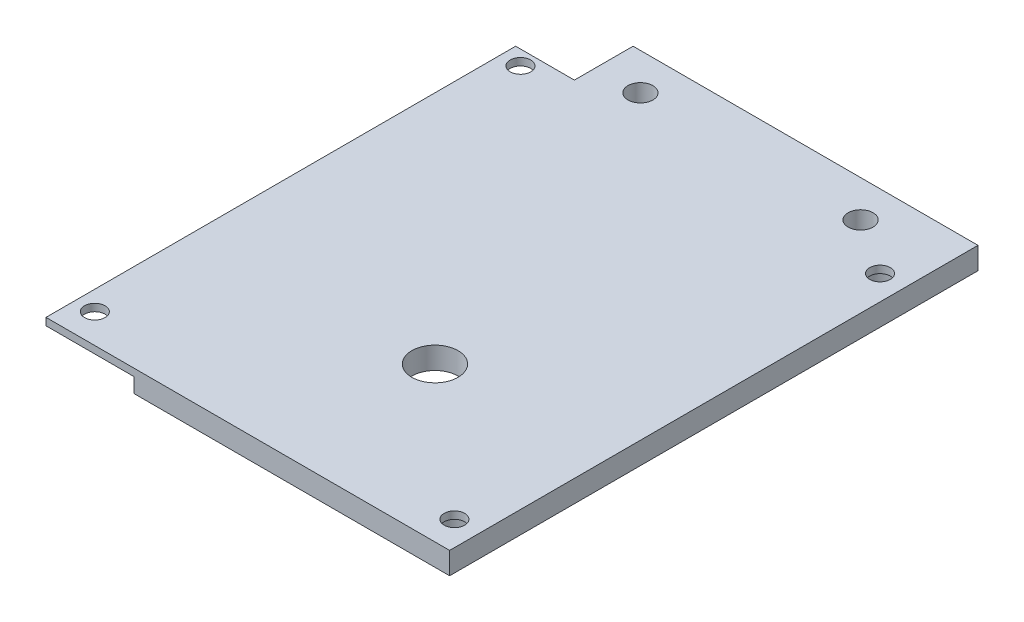
ISO-10303-21;
HEADER;
FILE_DESCRIPTION(('STEP AP214'),'2;1');
FILE_NAME('part.step','',(''),(''),'','','');
FILE_SCHEMA(('AUTOMOTIVE_DESIGN { 1 0 10303 214 1 1 1 1 }'));
ENDSEC;
DATA;
#1=APPLICATION_CONTEXT('core data for automotive mechanical design processes');
#2=APPLICATION_PROTOCOL_DEFINITION('international standard','automotive_design',2000,#1);
#3=PRODUCT_CONTEXT('',#1,'mechanical');
#4=PRODUCT('Part','Part','',(#3));
#5=PRODUCT_RELATED_PRODUCT_CATEGORY('part','',(#4));
#6=PRODUCT_DEFINITION_FORMATION('','',#4);
#7=PRODUCT_DEFINITION_CONTEXT('part definition',#1,'design');
#8=PRODUCT_DEFINITION('design','',#6,#7);
#9=PRODUCT_DEFINITION_SHAPE('','',#8);
#10=(LENGTH_UNIT() NAMED_UNIT(*) SI_UNIT(.MILLI.,.METRE.));
#11=(NAMED_UNIT(*) PLANE_ANGLE_UNIT() SI_UNIT($,.RADIAN.));
#12=(NAMED_UNIT(*) SI_UNIT($,.STERADIAN.) SOLID_ANGLE_UNIT());
#13=UNCERTAINTY_MEASURE_WITH_UNIT(LENGTH_MEASURE(1.E-05),#10,'distance_accuracy_value','');
#14=(GEOMETRIC_REPRESENTATION_CONTEXT(3) GLOBAL_UNCERTAINTY_ASSIGNED_CONTEXT((#13)) GLOBAL_UNIT_ASSIGNED_CONTEXT((#10,
#11,#12)) REPRESENTATION_CONTEXT('',''));
#15=CARTESIAN_POINT('',(0.,0.,0.));
#16=DIRECTION('',(0.,0.,1.));
#17=DIRECTION('',(1.,0.,0.));
#18=AXIS2_PLACEMENT_3D('',#15,#16,#17);
#19=CARTESIAN_POINT('',(0.,3.,36.));
#20=DIRECTION('',(0.,0.,-1.));
#21=DIRECTION('',(-1.,0.,0.));
#22=AXIS2_PLACEMENT_3D('',#19,#20,#21);
#23=PLANE('',#22);
#24=DIRECTION('',(0.,-1.,0.));
#25=VECTOR('',#24,1.);
#26=CARTESIAN_POINT('',(-17.,2.,36.));
#27=LINE('',#26,#25);
#28=CARTESIAN_POINT('',(-17.,2.,36.));
#29=VERTEX_POINT('',#28);
#30=CARTESIAN_POINT('',(-17.,0.,36.));
#31=VERTEX_POINT('',#30);
#32=EDGE_CURVE('E198',#29,#31,#27,.T.);
#33=ORIENTED_EDGE('',*,*,#32,.T.);
#34=DIRECTION('',(1.,0.,0.));
#35=VECTOR('',#34,1.);
#36=CARTESIAN_POINT('',(0.,0.,36.));
#37=LINE('',#36,#35);
#38=CARTESIAN_POINT('',(26.,0.,36.));
#39=VERTEX_POINT('',#38);
#40=EDGE_CURVE('E140',#31,#39,#37,.T.);
#41=ORIENTED_EDGE('',*,*,#40,.T.);
#42=DIRECTION('',(0.,-1.,0.));
#43=VECTOR('',#42,1.);
#44=CARTESIAN_POINT('',(26.,3.,36.));
#45=LINE('',#44,#43);
#46=CARTESIAN_POINT('',(26.,3.,36.));
#47=VERTEX_POINT('',#46);
#48=EDGE_CURVE('E104',#47,#39,#45,.T.);
#49=ORIENTED_EDGE('',*,*,#48,.F.);
#50=DIRECTION('',(1.,0.,0.));
#51=VECTOR('',#50,1.);
#52=CARTESIAN_POINT('',(0.,3.,36.));
#53=LINE('',#52,#51);
#54=CARTESIAN_POINT('',(-29.,3.,36.));
#55=VERTEX_POINT('',#54);
#56=EDGE_CURVE('E111',#55,#47,#53,.T.);
#57=ORIENTED_EDGE('',*,*,#56,.F.);
#58=DIRECTION('',(0.,-1.,0.));
#59=VECTOR('',#58,1.);
#60=CARTESIAN_POINT('',(-29.,3.,36.));
#61=LINE('',#60,#59);
#62=CARTESIAN_POINT('',(-29.,2.,36.));
#63=VERTEX_POINT('',#62);
#64=EDGE_CURVE('E43',#55,#63,#61,.T.);
#65=ORIENTED_EDGE('',*,*,#64,.T.);
#66=DIRECTION('',(1.,0.,0.));
#67=VECTOR('',#66,1.);
#68=CARTESIAN_POINT('',(0.,2.,36.));
#69=LINE('',#68,#67);
#70=EDGE_CURVE('E166',#63,#29,#69,.T.);
#71=ORIENTED_EDGE('',*,*,#70,.T.);
#72=EDGE_LOOP('',(#33,#41,#49,#57,#65,#71));
#73=FACE_BOUND('',#72,.T.);
#74=ADVANCED_FACE('F35',(#73),#23,.F.);
#75=CARTESIAN_POINT('',(0.,3.,-36.));
#76=DIRECTION('',(0.,0.,-1.));
#77=DIRECTION('',(-1.,0.,0.));
#78=AXIS2_PLACEMENT_3D('',#75,#76,#77);
#79=PLANE('',#78);
#80=DIRECTION('',(1.,0.,0.));
#81=VECTOR('',#80,1.);
#82=CARTESIAN_POINT('',(0.,0.,-36.));
#83=LINE('',#82,#81);
#84=CARTESIAN_POINT('',(-17.,0.,-36.));
#85=VERTEX_POINT('',#84);
#86=CARTESIAN_POINT('',(26.,0.,-36.));
#87=VERTEX_POINT('',#86);
#88=EDGE_CURVE('E75',#85,#87,#83,.T.);
#89=ORIENTED_EDGE('',*,*,#88,.F.);
#90=DIRECTION('',(0.,-1.,0.));
#91=VECTOR('',#90,1.);
#92=CARTESIAN_POINT('',(-17.,2.,-36.));
#93=LINE('',#92,#91);
#94=CARTESIAN_POINT('',(-17.,2.,-36.));
#95=VERTEX_POINT('',#94);
#96=EDGE_CURVE('E50',#95,#85,#93,.T.);
#97=ORIENTED_EDGE('',*,*,#96,.F.);
#98=DIRECTION('',(1.,0.,0.));
#99=VECTOR('',#98,1.);
#100=CARTESIAN_POINT('',(0.,2.,-36.));
#101=LINE('',#100,#99);
#102=CARTESIAN_POINT('',(-21.,2.,-36.));
#103=VERTEX_POINT('',#102);
#104=EDGE_CURVE('E186',#103,#95,#101,.T.);
#105=ORIENTED_EDGE('',*,*,#104,.F.);
#106=DIRECTION('',(0.,-1.,0.));
#107=VECTOR('',#106,1.);
#108=CARTESIAN_POINT('',(-21.,3.,-36.));
#109=LINE('',#108,#107);
#110=CARTESIAN_POINT('',(-21.,3.,-36.));
#111=VERTEX_POINT('',#110);
#112=EDGE_CURVE('E105',#111,#103,#109,.T.);
#113=ORIENTED_EDGE('',*,*,#112,.F.);
#114=DIRECTION('',(1.,0.,0.));
#115=VECTOR('',#114,1.);
#116=CARTESIAN_POINT('',(0.,3.,-36.));
#117=LINE('',#116,#115);
#118=CARTESIAN_POINT('',(26.,3.,-36.));
#119=VERTEX_POINT('',#118);
#120=EDGE_CURVE('E109',#111,#119,#117,.T.);
#121=ORIENTED_EDGE('',*,*,#120,.T.);
#122=DIRECTION('',(0.,-1.,0.));
#123=VECTOR('',#122,1.);
#124=CARTESIAN_POINT('',(26.,3.,-36.));
#125=LINE('',#124,#123);
#126=EDGE_CURVE('E96',#119,#87,#125,.T.);
#127=ORIENTED_EDGE('',*,*,#126,.T.);
#128=EDGE_LOOP('',(#89,#97,#105,#113,#121,#127));
#129=FACE_BOUND('',#128,.T.);
#130=ADVANCED_FACE('F114',(#129),#79,.T.);
#131=CARTESIAN_POINT('',(0.,3.,-28.));
#132=DIRECTION('',(0.,0.,-1.));
#133=DIRECTION('',(-1.,0.,0.));
#134=AXIS2_PLACEMENT_3D('',#131,#132,#133);
#135=PLANE('',#134);
#136=DIRECTION('',(1.,0.,0.));
#137=VECTOR('',#136,1.);
#138=CARTESIAN_POINT('',(0.,2.,-28.));
#139=LINE('',#138,#137);
#140=CARTESIAN_POINT('',(-29.,2.,-28.));
#141=VERTEX_POINT('',#140);
#142=CARTESIAN_POINT('',(-21.,2.,-28.));
#143=VERTEX_POINT('',#142);
#144=EDGE_CURVE('E177',#141,#143,#139,.T.);
#145=ORIENTED_EDGE('',*,*,#144,.F.);
#146=DIRECTION('',(0.,-1.,0.));
#147=VECTOR('',#146,1.);
#148=CARTESIAN_POINT('',(-29.,3.,-28.));
#149=LINE('',#148,#147);
#150=CARTESIAN_POINT('',(-29.,3.,-28.));
#151=VERTEX_POINT('',#150);
#152=EDGE_CURVE('E11',#151,#141,#149,.T.);
#153=ORIENTED_EDGE('',*,*,#152,.F.);
#154=DIRECTION('',(1.,0.,0.));
#155=VECTOR('',#154,1.);
#156=CARTESIAN_POINT('',(0.,3.,-28.));
#157=LINE('',#156,#155);
#158=CARTESIAN_POINT('',(-21.,3.,-28.));
#159=VERTEX_POINT('',#158);
#160=EDGE_CURVE('E212',#151,#159,#157,.T.);
#161=ORIENTED_EDGE('',*,*,#160,.T.);
#162=DIRECTION('',(0.,-1.,0.));
#163=VECTOR('',#162,1.);
#164=CARTESIAN_POINT('',(-21.,3.,-28.));
#165=LINE('',#164,#163);
#166=EDGE_CURVE('E139',#159,#143,#165,.T.);
#167=ORIENTED_EDGE('',*,*,#166,.T.);
#168=EDGE_LOOP('',(#145,#153,#161,#167));
#169=FACE_BOUND('',#168,.T.);
#170=ADVANCED_FACE('F214',(#169),#135,.T.);
#171=CARTESIAN_POINT('',(-29.,3.,0.));
#172=DIRECTION('',(1.,0.,0.));
#173=DIRECTION('',(0.,0.,-1.));
#174=AXIS2_PLACEMENT_3D('',#171,#172,#173);
#175=PLANE('',#174);
#176=ORIENTED_EDGE('',*,*,#152,.T.);
#177=DIRECTION('',(0.,0.,1.));
#178=VECTOR('',#177,1.);
#179=CARTESIAN_POINT('',(-29.,2.,0.));
#180=LINE('',#179,#178);
#181=EDGE_CURVE('E174',#141,#63,#180,.T.);
#182=ORIENTED_EDGE('',*,*,#181,.T.);
#183=ORIENTED_EDGE('',*,*,#64,.F.);
#184=DIRECTION('',(0.,0.,1.));
#185=VECTOR('',#184,1.);
#186=CARTESIAN_POINT('',(-29.,3.,0.));
#187=LINE('',#186,#185);
#188=EDGE_CURVE('E172',#151,#55,#187,.T.);
#189=ORIENTED_EDGE('',*,*,#188,.F.);
#190=EDGE_LOOP('',(#176,#182,#183,#189));
#191=FACE_BOUND('',#190,.T.);
#192=ADVANCED_FACE('F171',(#191),#175,.F.);
#193=CARTESIAN_POINT('',(26.,3.,0.));
#194=DIRECTION('',(1.,0.,0.));
#195=DIRECTION('',(0.,0.,-1.));
#196=AXIS2_PLACEMENT_3D('',#193,#194,#195);
#197=PLANE('',#196);
#198=DIRECTION('',(0.,0.,1.));
#199=VECTOR('',#198,1.);
#200=CARTESIAN_POINT('',(26.,0.,0.));
#201=LINE('',#200,#199);
#202=EDGE_CURVE('E101',#87,#39,#201,.T.);
#203=ORIENTED_EDGE('',*,*,#202,.F.);
#204=ORIENTED_EDGE('',*,*,#126,.F.);
#205=DIRECTION('',(0.,0.,1.));
#206=VECTOR('',#205,1.);
#207=CARTESIAN_POINT('',(26.,3.,0.));
#208=LINE('',#207,#206);
#209=EDGE_CURVE('E100',#119,#47,#208,.T.);
#210=ORIENTED_EDGE('',*,*,#209,.T.);
#211=ORIENTED_EDGE('',*,*,#48,.T.);
#212=EDGE_LOOP('',(#203,#204,#210,#211));
#213=FACE_BOUND('',#212,.T.);
#214=ADVANCED_FACE('F98',(#213),#197,.T.);
#215=CARTESIAN_POINT('',(22.6521115291552,3.,-26.));
#216=DIRECTION('',(0.,-1.,0.));
#217=DIRECTION('',(0.,0.,-1.));
#218=AXIS2_PLACEMENT_3D('',#215,#216,#217);
#219=CYLINDRICAL_SURFACE('',#218,1.4);
#220=CARTESIAN_POINT('',(22.6521115291552,2.,-26.));
#221=DIRECTION('',(0.,1.,0.));
#222=DIRECTION('',(0.,0.,1.));
#223=AXIS2_PLACEMENT_3D('',#220,#221,#222);
#224=CIRCLE('',#223,1.4);
#225=CARTESIAN_POINT('',(22.6521115291552,2.,-24.6));
#226=VERTEX_POINT('',#225);
#227=EDGE_CURVE('E488',#226,#226,#224,.T.);
#228=ORIENTED_EDGE('',*,*,#227,.F.);
#229=EDGE_LOOP('',(#228));
#230=FACE_BOUND('',#229,.T.);
#231=CARTESIAN_POINT('',(22.6521115291552,3.,-26.));
#232=DIRECTION('',(0.,1.,0.));
#233=DIRECTION('',(0.,0.,1.));
#234=AXIS2_PLACEMENT_3D('',#231,#232,#233);
#235=CIRCLE('',#234,1.4);
#236=CARTESIAN_POINT('',(22.6521115291552,3.,-24.6));
#237=VERTEX_POINT('',#236);
#238=EDGE_CURVE('E133',#237,#237,#235,.T.);
#239=ORIENTED_EDGE('',*,*,#238,.T.);
#240=EDGE_LOOP('',(#239));
#241=FACE_BOUND('',#240,.T.);
#242=ADVANCED_FACE('F259',(#230,#241),#219,.F.);
#243=CARTESIAN_POINT('',(-26.3478884708448,3.,32.));
#244=DIRECTION('',(0.,-1.,0.));
#245=DIRECTION('',(0.,0.,-1.));
#246=AXIS2_PLACEMENT_3D('',#243,#244,#245);
#247=CYLINDRICAL_SURFACE('',#246,1.4);
#248=CARTESIAN_POINT('',(-26.3478884708448,2.,32.));
#249=DIRECTION('',(0.,1.,0.));
#250=DIRECTION('',(0.,0.,1.));
#251=AXIS2_PLACEMENT_3D('',#248,#249,#250);
#252=CIRCLE('',#251,1.4);
#253=CARTESIAN_POINT('',(-26.3478884708448,2.,33.4));
#254=VERTEX_POINT('',#253);
#255=EDGE_CURVE('E181',#254,#254,#252,.T.);
#256=ORIENTED_EDGE('',*,*,#255,.F.);
#257=EDGE_LOOP('',(#256));
#258=FACE_BOUND('',#257,.T.);
#259=CARTESIAN_POINT('',(-26.3478884708448,3.,32.));
#260=DIRECTION('',(0.,1.,0.));
#261=DIRECTION('',(0.,0.,1.));
#262=AXIS2_PLACEMENT_3D('',#259,#260,#261);
#263=CIRCLE('',#262,1.4);
#264=CARTESIAN_POINT('',(-26.3478884708448,3.,33.4));
#265=VERTEX_POINT('',#264);
#266=EDGE_CURVE('E130',#265,#265,#263,.T.);
#267=ORIENTED_EDGE('',*,*,#266,.T.);
#268=EDGE_LOOP('',(#267));
#269=FACE_BOUND('',#268,.T.);
#270=ADVANCED_FACE('F249',(#258,#269),#247,.F.);
#271=CARTESIAN_POINT('',(15.,3.,-31.));
#272=DIRECTION('',(0.,-1.,0.));
#273=DIRECTION('',(0.,0.,-1.));
#274=AXIS2_PLACEMENT_3D('',#271,#272,#273);
#275=CYLINDRICAL_SURFACE('',#274,1.70000000000001);
#276=CARTESIAN_POINT('',(15.,3.,-31.));
#277=DIRECTION('',(0.,1.,0.));
#278=DIRECTION('',(0.,0.,1.));
#279=AXIS2_PLACEMENT_3D('',#276,#277,#278);
#280=CIRCLE('',#279,1.70000000000001);
#281=CARTESIAN_POINT('',(15.,3.,-29.3));
#282=VERTEX_POINT('',#281);
#283=EDGE_CURVE('E127',#282,#282,#280,.T.);
#284=ORIENTED_EDGE('',*,*,#283,.T.);
#285=EDGE_LOOP('',(#284));
#286=FACE_BOUND('',#285,.T.);
#287=CARTESIAN_POINT('',(15.,0.,-31.));
#288=DIRECTION('',(0.,1.,0.));
#289=DIRECTION('',(0.,0.,1.));
#290=AXIS2_PLACEMENT_3D('',#287,#288,#289);
#291=CIRCLE('',#290,1.70000000000001);
#292=CARTESIAN_POINT('',(15.,0.,-29.3));
#293=VERTEX_POINT('',#292);
#294=EDGE_CURVE('E151',#293,#293,#291,.T.);
#295=ORIENTED_EDGE('',*,*,#294,.F.);
#296=EDGE_LOOP('',(#295));
#297=FACE_BOUND('',#296,.T.);
#298=ADVANCED_FACE('F246',(#286,#297),#275,.F.);
#299=CARTESIAN_POINT('',(-15.,3.,-31.));
#300=DIRECTION('',(0.,-1.,0.));
#301=DIRECTION('',(0.,0.,-1.));
#302=AXIS2_PLACEMENT_3D('',#299,#300,#301);
#303=CYLINDRICAL_SURFACE('',#302,1.70000000000001);
#304=CARTESIAN_POINT('',(-15.,3.,-31.));
#305=DIRECTION('',(0.,1.,0.));
#306=DIRECTION('',(0.,0.,1.));
#307=AXIS2_PLACEMENT_3D('',#304,#305,#306);
#308=CIRCLE('',#307,1.70000000000001);
#309=CARTESIAN_POINT('',(-15.,3.,-29.3));
#310=VERTEX_POINT('',#309);
#311=EDGE_CURVE('E124',#310,#310,#308,.T.);
#312=ORIENTED_EDGE('',*,*,#311,.T.);
#313=EDGE_LOOP('',(#312));
#314=FACE_BOUND('',#313,.T.);
#315=CARTESIAN_POINT('',(-15.,0.,-31.));
#316=DIRECTION('',(0.,1.,0.));
#317=DIRECTION('',(0.,0.,1.));
#318=AXIS2_PLACEMENT_3D('',#315,#316,#317);
#319=CIRCLE('',#318,1.70000000000001);
#320=CARTESIAN_POINT('',(-15.,0.,-29.3));
#321=VERTEX_POINT('',#320);
#322=EDGE_CURVE('E148',#321,#321,#319,.T.);
#323=ORIENTED_EDGE('',*,*,#322,.F.);
#324=EDGE_LOOP('',(#323));
#325=FACE_BOUND('',#324,.T.);
#326=ADVANCED_FACE('F248',(#314,#325),#303,.F.);
#327=CARTESIAN_POINT('',(3.,3.,15.));
#328=DIRECTION('',(0.,-1.,0.));
#329=DIRECTION('',(0.,0.,-1.));
#330=AXIS2_PLACEMENT_3D('',#327,#328,#329);
#331=CYLINDRICAL_SURFACE('',#330,3.15);
#332=CARTESIAN_POINT('',(3.,3.,15.));
#333=DIRECTION('',(0.,1.,0.));
#334=DIRECTION('',(0.,0.,1.));
#335=AXIS2_PLACEMENT_3D('',#332,#333,#334);
#336=CIRCLE('',#335,3.15);
#337=CARTESIAN_POINT('',(3.,3.,18.15));
#338=VERTEX_POINT('',#337);
#339=EDGE_CURVE('E118',#338,#338,#336,.T.);
#340=ORIENTED_EDGE('',*,*,#339,.T.);
#341=EDGE_LOOP('',(#340));
#342=FACE_BOUND('',#341,.T.);
#343=CARTESIAN_POINT('',(3.,0.,15.));
#344=DIRECTION('',(0.,1.,0.));
#345=DIRECTION('',(0.,0.,1.));
#346=AXIS2_PLACEMENT_3D('',#343,#344,#345);
#347=CIRCLE('',#346,3.15);
#348=CARTESIAN_POINT('',(3.,0.,18.15));
#349=VERTEX_POINT('',#348);
#350=EDGE_CURVE('E145',#349,#349,#347,.T.);
#351=ORIENTED_EDGE('',*,*,#350,.F.);
#352=EDGE_LOOP('',(#351));
#353=FACE_BOUND('',#352,.T.);
#354=ADVANCED_FACE('F256',(#342,#353),#331,.F.);
#355=CARTESIAN_POINT('',(-21.,3.,0.));
#356=DIRECTION('',(1.,0.,0.));
#357=DIRECTION('',(0.,0.,-1.));
#358=AXIS2_PLACEMENT_3D('',#355,#356,#357);
#359=PLANE('',#358);
#360=ORIENTED_EDGE('',*,*,#112,.T.);
#361=DIRECTION('',(0.,0.,1.));
#362=VECTOR('',#361,1.);
#363=CARTESIAN_POINT('',(-21.,2.,0.));
#364=LINE('',#363,#362);
#365=EDGE_CURVE('E189',#103,#143,#364,.T.);
#366=ORIENTED_EDGE('',*,*,#365,.T.);
#367=ORIENTED_EDGE('',*,*,#166,.F.);
#368=DIRECTION('',(0.,0.,1.));
#369=VECTOR('',#368,1.);
#370=CARTESIAN_POINT('',(-21.,3.,0.));
#371=LINE('',#370,#369);
#372=EDGE_CURVE('E59',#111,#159,#371,.T.);
#373=ORIENTED_EDGE('',*,*,#372,.F.);
#374=EDGE_LOOP('',(#360,#366,#367,#373));
#375=FACE_BOUND('',#374,.T.);
#376=ADVANCED_FACE('F217',(#375),#359,.F.);
#377=CARTESIAN_POINT('',(-26.3478884708448,3.,-26.));
#378=DIRECTION('',(0.,-1.,0.));
#379=DIRECTION('',(0.,0.,-1.));
#380=AXIS2_PLACEMENT_3D('',#377,#378,#379);
#381=CYLINDRICAL_SURFACE('',#380,1.4);
#382=CARTESIAN_POINT('',(-26.3478884708448,2.,-26.));
#383=DIRECTION('',(0.,1.,0.));
#384=DIRECTION('',(0.,0.,1.));
#385=AXIS2_PLACEMENT_3D('',#382,#383,#384);
#386=CIRCLE('',#385,1.4);
#387=CARTESIAN_POINT('',(-26.3478884708448,2.,-24.6));
#388=VERTEX_POINT('',#387);
#389=EDGE_CURVE('E192',#388,#388,#386,.T.);
#390=ORIENTED_EDGE('',*,*,#389,.F.);
#391=EDGE_LOOP('',(#390));
#392=FACE_BOUND('',#391,.T.);
#393=CARTESIAN_POINT('',(-26.3478884708448,3.,-26.));
#394=DIRECTION('',(0.,1.,0.));
#395=DIRECTION('',(0.,0.,1.));
#396=AXIS2_PLACEMENT_3D('',#393,#394,#395);
#397=CIRCLE('',#396,1.4);
#398=CARTESIAN_POINT('',(-26.3478884708448,3.,-24.6));
#399=VERTEX_POINT('',#398);
#400=EDGE_CURVE('E154',#399,#399,#397,.T.);
#401=ORIENTED_EDGE('',*,*,#400,.T.);
#402=EDGE_LOOP('',(#401));
#403=FACE_BOUND('',#402,.T.);
#404=ADVANCED_FACE('F37',(#392,#403),#381,.F.);
#405=CARTESIAN_POINT('',(22.6521115291552,3.,32.));
#406=DIRECTION('',(0.,-1.,0.));
#407=DIRECTION('',(0.,0.,-1.));
#408=AXIS2_PLACEMENT_3D('',#405,#406,#407);
#409=CYLINDRICAL_SURFACE('',#408,1.4);
#410=CARTESIAN_POINT('',(22.6521115291552,2.,32.));
#411=DIRECTION('',(0.,1.,0.));
#412=DIRECTION('',(0.,0.,1.));
#413=AXIS2_PLACEMENT_3D('',#410,#411,#412);
#414=CIRCLE('',#413,1.4);
#415=CARTESIAN_POINT('',(22.6521115291552,2.,33.4));
#416=VERTEX_POINT('',#415);
#417=EDGE_CURVE('E201',#416,#416,#414,.T.);
#418=ORIENTED_EDGE('',*,*,#417,.F.);
#419=EDGE_LOOP('',(#418));
#420=FACE_BOUND('',#419,.T.);
#421=CARTESIAN_POINT('',(22.6521115291552,3.,32.));
#422=DIRECTION('',(0.,1.,0.));
#423=DIRECTION('',(0.,0.,1.));
#424=AXIS2_PLACEMENT_3D('',#421,#422,#423);
#425=CIRCLE('',#424,1.4);
#426=CARTESIAN_POINT('',(22.6521115291552,3.,33.4));
#427=VERTEX_POINT('',#426);
#428=EDGE_CURVE('E136',#427,#427,#425,.T.);
#429=ORIENTED_EDGE('',*,*,#428,.T.);
#430=EDGE_LOOP('',(#429));
#431=FACE_BOUND('',#430,.T.);
#432=ADVANCED_FACE('F316',(#420,#431),#409,.F.);
#433=CARTESIAN_POINT('',(0.,3.,0.));
#434=DIRECTION('',(0.,1.,0.));
#435=DIRECTION('',(0.,0.,1.));
#436=AXIS2_PLACEMENT_3D('',#433,#434,#435);
#437=PLANE('',#436);
#438=ORIENTED_EDGE('',*,*,#400,.F.);
#439=EDGE_LOOP('',(#438));
#440=FACE_BOUND('',#439,.T.);
#441=ORIENTED_EDGE('',*,*,#160,.F.);
#442=ORIENTED_EDGE('',*,*,#188,.T.);
#443=ORIENTED_EDGE('',*,*,#56,.T.);
#444=ORIENTED_EDGE('',*,*,#209,.F.);
#445=ORIENTED_EDGE('',*,*,#120,.F.);
#446=ORIENTED_EDGE('',*,*,#372,.T.);
#447=EDGE_LOOP('',(#441,#442,#443,#444,#445,#446));
#448=FACE_BOUND('',#447,.T.);
#449=ORIENTED_EDGE('',*,*,#339,.F.);
#450=EDGE_LOOP('',(#449));
#451=FACE_BOUND('',#450,.T.);
#452=ORIENTED_EDGE('',*,*,#311,.F.);
#453=EDGE_LOOP('',(#452));
#454=FACE_BOUND('',#453,.T.);
#455=ORIENTED_EDGE('',*,*,#283,.F.);
#456=EDGE_LOOP('',(#455));
#457=FACE_BOUND('',#456,.T.);
#458=ORIENTED_EDGE('',*,*,#266,.F.);
#459=EDGE_LOOP('',(#458));
#460=FACE_BOUND('',#459,.T.);
#461=ORIENTED_EDGE('',*,*,#238,.F.);
#462=EDGE_LOOP('',(#461));
#463=FACE_BOUND('',#462,.T.);
#464=ORIENTED_EDGE('',*,*,#428,.F.);
#465=EDGE_LOOP('',(#464));
#466=FACE_BOUND('',#465,.T.);
#467=ADVANCED_FACE('F107',(#440,#448,#451,#454,#457,#460,#463,#466),#437,.T.);
#468=CARTESIAN_POINT('',(0.,0.,0.));
#469=DIRECTION('',(0.,1.,0.));
#470=DIRECTION('',(0.,0.,1.));
#471=AXIS2_PLACEMENT_3D('',#468,#469,#470);
#472=PLANE('',#471);
#473=DIRECTION('',(0.,0.,-1.));
#474=VECTOR('',#473,1.);
#475=CARTESIAN_POINT('',(-17.,0.,0.));
#476=LINE('',#475,#474);
#477=EDGE_CURVE('E195',#31,#85,#476,.T.);
#478=ORIENTED_EDGE('',*,*,#477,.T.);
#479=ORIENTED_EDGE('',*,*,#88,.T.);
#480=ORIENTED_EDGE('',*,*,#202,.T.);
#481=ORIENTED_EDGE('',*,*,#40,.F.);
#482=EDGE_LOOP('',(#478,#479,#480,#481));
#483=FACE_BOUND('',#482,.T.);
#484=CARTESIAN_POINT('',(22.6521115291552,0.,-26.));
#485=DIRECTION('',(0.,1.,0.));
#486=DIRECTION('',(0.,0.,1.));
#487=AXIS2_PLACEMENT_3D('',#484,#485,#486);
#488=CIRCLE('',#487,2.4);
#489=CARTESIAN_POINT('',(22.6521115291552,0.,-23.6));
#490=VERTEX_POINT('',#489);
#491=EDGE_CURVE('E200',#490,#490,#488,.T.);
#492=ORIENTED_EDGE('',*,*,#491,.T.);
#493=EDGE_LOOP('',(#492));
#494=FACE_BOUND('',#493,.T.);
#495=CARTESIAN_POINT('',(22.6521115291552,0.,32.));
#496=DIRECTION('',(0.,1.,0.));
#497=DIRECTION('',(0.,0.,1.));
#498=AXIS2_PLACEMENT_3D('',#495,#496,#497);
#499=CIRCLE('',#498,2.4);
#500=CARTESIAN_POINT('',(22.6521115291552,0.,34.4));
#501=VERTEX_POINT('',#500);
#502=EDGE_CURVE('E204',#501,#501,#499,.T.);
#503=ORIENTED_EDGE('',*,*,#502,.T.);
#504=EDGE_LOOP('',(#503));
#505=FACE_BOUND('',#504,.T.);
#506=ORIENTED_EDGE('',*,*,#350,.T.);
#507=EDGE_LOOP('',(#506));
#508=FACE_BOUND('',#507,.T.);
#509=ORIENTED_EDGE('',*,*,#322,.T.);
#510=EDGE_LOOP('',(#509));
#511=FACE_BOUND('',#510,.T.);
#512=ORIENTED_EDGE('',*,*,#294,.T.);
#513=EDGE_LOOP('',(#512));
#514=FACE_BOUND('',#513,.T.);
#515=ADVANCED_FACE('F230',(#483,#494,#505,#508,#511,#514),#472,.F.);
#516=CARTESIAN_POINT('',(22.6521115291552,2.,32.));
#517=DIRECTION('',(0.,-1.,0.));
#518=DIRECTION('',(0.,0.,-1.));
#519=AXIS2_PLACEMENT_3D('',#516,#517,#518);
#520=CYLINDRICAL_SURFACE('',#519,2.4);
#521=CARTESIAN_POINT('',(22.6521115291552,2.,32.));
#522=DIRECTION('',(0.,1.,0.));
#523=DIRECTION('',(0.,0.,1.));
#524=AXIS2_PLACEMENT_3D('',#521,#522,#523);
#525=CIRCLE('',#524,2.4);
#526=CARTESIAN_POINT('',(22.6521115291552,2.,34.4));
#527=VERTEX_POINT('',#526);
#528=EDGE_CURVE('E142',#527,#527,#525,.T.);
#529=ORIENTED_EDGE('',*,*,#528,.T.);
#530=EDGE_LOOP('',(#529));
#531=FACE_BOUND('',#530,.T.);
#532=ORIENTED_EDGE('',*,*,#502,.F.);
#533=EDGE_LOOP('',(#532));
#534=FACE_BOUND('',#533,.T.);
#535=ADVANCED_FACE('F233',(#531,#534),#520,.F.);
#536=CARTESIAN_POINT('',(0.,2.,0.));
#537=DIRECTION('',(0.,1.,0.));
#538=DIRECTION('',(0.,0.,1.));
#539=AXIS2_PLACEMENT_3D('',#536,#537,#538);
#540=PLANE('',#539);
#541=ORIENTED_EDGE('',*,*,#417,.T.);
#542=EDGE_LOOP('',(#541));
#543=FACE_BOUND('',#542,.T.);
#544=ORIENTED_EDGE('',*,*,#528,.F.);
#545=EDGE_LOOP('',(#544));
#546=FACE_BOUND('',#545,.T.);
#547=ADVANCED_FACE('F344',(#543,#546),#540,.F.);
#548=CARTESIAN_POINT('',(22.6521115291552,2.,-26.));
#549=DIRECTION('',(0.,-1.,0.));
#550=DIRECTION('',(0.,0.,-1.));
#551=AXIS2_PLACEMENT_3D('',#548,#549,#550);
#552=CYLINDRICAL_SURFACE('',#551,2.4);
#553=CARTESIAN_POINT('',(22.6521115291552,2.,-26.));
#554=DIRECTION('',(0.,1.,0.));
#555=DIRECTION('',(0.,0.,1.));
#556=AXIS2_PLACEMENT_3D('',#553,#554,#555);
#557=CIRCLE('',#556,2.4);
#558=CARTESIAN_POINT('',(22.6521115291552,2.,-23.6));
#559=VERTEX_POINT('',#558);
#560=EDGE_CURVE('E209',#559,#559,#557,.T.);
#561=ORIENTED_EDGE('',*,*,#560,.T.);
#562=EDGE_LOOP('',(#561));
#563=FACE_BOUND('',#562,.T.);
#564=ORIENTED_EDGE('',*,*,#491,.F.);
#565=EDGE_LOOP('',(#564));
#566=FACE_BOUND('',#565,.T.);
#567=ADVANCED_FACE('F355',(#563,#566),#552,.F.);
#568=CARTESIAN_POINT('',(0.,2.,0.));
#569=DIRECTION('',(0.,1.,0.));
#570=DIRECTION('',(0.,0.,1.));
#571=AXIS2_PLACEMENT_3D('',#568,#569,#570);
#572=PLANE('',#571);
#573=ORIENTED_EDGE('',*,*,#227,.T.);
#574=EDGE_LOOP('',(#573));
#575=FACE_BOUND('',#574,.T.);
#576=ORIENTED_EDGE('',*,*,#560,.F.);
#577=EDGE_LOOP('',(#576));
#578=FACE_BOUND('',#577,.T.);
#579=ADVANCED_FACE('F365',(#575,#578),#572,.F.);
#580=CARTESIAN_POINT('',(-17.,2.,0.));
#581=DIRECTION('',(-1.,0.,0.));
#582=DIRECTION('',(0.,0.,1.));
#583=AXIS2_PLACEMENT_3D('',#580,#581,#582);
#584=PLANE('',#583);
#585=ORIENTED_EDGE('',*,*,#477,.F.);
#586=ORIENTED_EDGE('',*,*,#32,.F.);
#587=DIRECTION('',(0.,0.,-1.));
#588=VECTOR('',#587,1.);
#589=CARTESIAN_POINT('',(-17.,2.,0.));
#590=LINE('',#589,#588);
#591=EDGE_CURVE('E179',#29,#95,#590,.T.);
#592=ORIENTED_EDGE('',*,*,#591,.T.);
#593=ORIENTED_EDGE('',*,*,#96,.T.);
#594=EDGE_LOOP('',(#585,#586,#592,#593));
#595=FACE_BOUND('',#594,.T.);
#596=ADVANCED_FACE('F228',(#595),#584,.T.);
#597=CARTESIAN_POINT('',(0.,2.,0.));
#598=DIRECTION('',(0.,1.,0.));
#599=DIRECTION('',(0.,0.,1.));
#600=AXIS2_PLACEMENT_3D('',#597,#598,#599);
#601=PLANE('',#600);
#602=ORIENTED_EDGE('',*,*,#255,.T.);
#603=EDGE_LOOP('',(#602));
#604=FACE_BOUND('',#603,.T.);
#605=ORIENTED_EDGE('',*,*,#144,.T.);
#606=ORIENTED_EDGE('',*,*,#365,.F.);
#607=ORIENTED_EDGE('',*,*,#104,.T.);
#608=ORIENTED_EDGE('',*,*,#591,.F.);
#609=ORIENTED_EDGE('',*,*,#70,.F.);
#610=ORIENTED_EDGE('',*,*,#181,.F.);
#611=EDGE_LOOP('',(#605,#606,#607,#608,#609,#610));
#612=FACE_BOUND('',#611,.T.);
#613=ORIENTED_EDGE('',*,*,#389,.T.);
#614=EDGE_LOOP('',(#613));
#615=FACE_BOUND('',#614,.T.);
#616=ADVANCED_FACE('F219',(#604,#612,#615),#601,.F.);
#617=CLOSED_SHELL('',(#74,#130,#170,#192,#214,#242,#270,#298,#326,#354,#376,#404,#432,#467,#515,
#535,#547,#567,#579,#596,#616));
#618=MANIFOLD_SOLID_BREP('B2',#617);
#619=ADVANCED_BREP_SHAPE_REPRESENTATION('',(#18,#618),#14);
#620=SHAPE_DEFINITION_REPRESENTATION(#9,#619);
ENDSEC;
END-ISO-10303-21;
